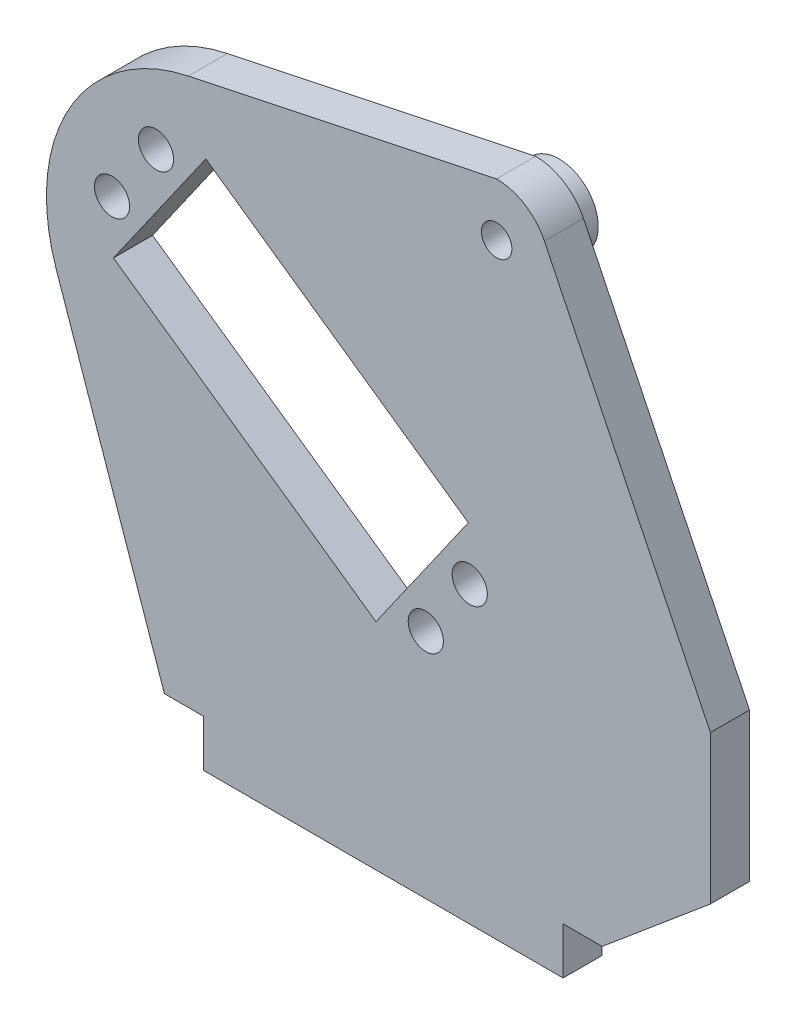
ISO-10303-21;
HEADER;
FILE_DESCRIPTION(('STEP AP214'),'2;1');
FILE_NAME('part.step','',(''),(''),'','','');
FILE_SCHEMA(('AUTOMOTIVE_DESIGN { 1 0 10303 214 1 1 1 1 }'));
ENDSEC;
DATA;
#1=APPLICATION_CONTEXT('core data for automotive mechanical design processes');
#2=APPLICATION_PROTOCOL_DEFINITION('international standard','automotive_design',2000,#1);
#3=PRODUCT_CONTEXT('',#1,'mechanical');
#4=PRODUCT('Part','Part','',(#3));
#5=PRODUCT_RELATED_PRODUCT_CATEGORY('part','',(#4));
#6=PRODUCT_DEFINITION_FORMATION('','',#4);
#7=PRODUCT_DEFINITION_CONTEXT('part definition',#1,'design');
#8=PRODUCT_DEFINITION('design','',#6,#7);
#9=PRODUCT_DEFINITION_SHAPE('','',#8);
#10=(LENGTH_UNIT() NAMED_UNIT(*) SI_UNIT(.MILLI.,.METRE.));
#11=(NAMED_UNIT(*) PLANE_ANGLE_UNIT() SI_UNIT($,.RADIAN.));
#12=(NAMED_UNIT(*) SI_UNIT($,.STERADIAN.) SOLID_ANGLE_UNIT());
#13=UNCERTAINTY_MEASURE_WITH_UNIT(LENGTH_MEASURE(1.E-05),#10,'distance_accuracy_value','');
#14=(GEOMETRIC_REPRESENTATION_CONTEXT(3) GLOBAL_UNCERTAINTY_ASSIGNED_CONTEXT((#13)) GLOBAL_UNIT_ASSIGNED_CONTEXT((#10,
#11,#12)) REPRESENTATION_CONTEXT('',''));
#15=CARTESIAN_POINT('',(0.,0.,0.));
#16=DIRECTION('',(0.,0.,1.));
#17=DIRECTION('',(1.,0.,0.));
#18=AXIS2_PLACEMENT_3D('',#15,#16,#17);
#19=CARTESIAN_POINT('',(-20.2199999704329,57.5799999999971,-5.));
#20=DIRECTION('',(0.,0.,1.));
#21=DIRECTION('',(1.,0.,0.));
#22=AXIS2_PLACEMENT_3D('',#19,#20,#21);
#23=PLANE('',#22);
#24=CARTESIAN_POINT('',(-20.2199999704329,57.5799999999971,-5.));
#25=DIRECTION('',(0.,0.,1.));
#26=DIRECTION('',(1.,0.,0.));
#27=AXIS2_PLACEMENT_3D('',#24,#25,#26);
#28=CIRCLE('',#27,22.8750000000009);
#29=CARTESIAN_POINT('',(-24.9455834674101,79.9615657542766,-5.));
#30=VERTEX_POINT('',#29);
#31=CARTESIAN_POINT('',(-41.8437615963378,50.1181933725053,-5.));
#32=VERTEX_POINT('',#31);
#33=EDGE_CURVE('E186',#30,#32,#28,.T.);
#34=ORIENTED_EDGE('',*,*,#33,.F.);
#35=DIRECTION('',(-0.978429104012181,-0.20658288511375,0.));
#36=VECTOR('',#35,1.);
#37=CARTESIAN_POINT('',(-24.9455834674101,79.9615657542766,-5.));
#38=LINE('',#37,#36);
#39=CARTESIAN_POINT('',(14.4999999833288,88.2899999768826,-5.));
#40=VERTEX_POINT('',#39);
#41=EDGE_CURVE('E220',#40,#30,#38,.T.);
#42=ORIENTED_EDGE('',*,*,#41,.F.);
#43=CARTESIAN_POINT('',(14.4999999833288,81.4999999892322,-5.));
#44=DIRECTION('',(0.,0.,1.));
#45=DIRECTION('',(1.,0.,0.));
#46=AXIS2_PLACEMENT_3D('',#43,#44,#45);
#47=CIRCLE('',#46,6.78999998765046);
#48=CARTESIAN_POINT('',(20.6106057278953,84.4605062410011,-5.));
#49=VERTEX_POINT('',#48);
#50=EDGE_CURVE('E217',#49,#40,#47,.T.);
#51=ORIENTED_EDGE('',*,*,#50,.F.);
#52=DIRECTION('',(-0.436009758049115,0.899941937508167,0.));
#53=VECTOR('',#52,1.);
#54=CARTESIAN_POINT('',(41.849999867857,40.6215297939108,-5.));
#55=LINE('',#54,#53);
#56=CARTESIAN_POINT('',(41.849999867857,40.6215297939108,-5.));
#57=VERTEX_POINT('',#56);
#58=EDGE_CURVE('E214',#57,#49,#55,.T.);
#59=ORIENTED_EDGE('',*,*,#58,.F.);
#60=DIRECTION('',(0.,1.,0.));
#61=VECTOR('',#60,1.);
#62=CARTESIAN_POINT('',(41.849999867857,21.6215298027008,-5.));
#63=LINE('',#62,#61);
#64=CARTESIAN_POINT('',(41.849999867857,21.6215298027008,-5.));
#65=VERTEX_POINT('',#64);
#66=EDGE_CURVE('E211',#65,#57,#63,.T.);
#67=ORIENTED_EDGE('',*,*,#66,.F.);
#68=DIRECTION('',(0.766044442804859,0.642787610060892,0.));
#69=VECTOR('',#68,1.);
#70=CARTESIAN_POINT('',(27.9999999773174,9.99999999120996,-5.));
#71=LINE('',#70,#69);
#72=CARTESIAN_POINT('',(27.9999999773174,9.99999999120996,-5.));
#73=VERTEX_POINT('',#72);
#74=EDGE_CURVE('E208',#73,#65,#71,.T.);
#75=ORIENTED_EDGE('',*,*,#74,.F.);
#76=DIRECTION('',(1.,0.,0.));
#77=VECTOR('',#76,1.);
#78=CARTESIAN_POINT('',(27.9999999773174,9.99999999120996,-5.));
#79=LINE('',#78,#77);
#80=CARTESIAN_POINT('',(22.9999999954636,9.99999999120996,-5.));
#81=VERTEX_POINT('',#80);
#82=EDGE_CURVE('E205',#81,#73,#79,.T.);
#83=ORIENTED_EDGE('',*,*,#82,.F.);
#84=DIRECTION('',(0.,1.,0.));
#85=VECTOR('',#84,1.);
#86=CARTESIAN_POINT('',(22.9999999954636,3.99999999120996,-5.));
#87=LINE('',#86,#85);
#88=CARTESIAN_POINT('',(22.9999999954636,3.99999999120996,-5.));
#89=VERTEX_POINT('',#88);
#90=EDGE_CURVE('E202',#89,#81,#87,.T.);
#91=ORIENTED_EDGE('',*,*,#90,.F.);
#92=DIRECTION('',(1.,0.,0.));
#93=VECTOR('',#92,1.);
#94=CARTESIAN_POINT('',(-22.9999999954636,3.99999999120996,-5.));
#95=LINE('',#94,#93);
#96=CARTESIAN_POINT('',(-22.9999999954636,3.99999999120996,-5.));
#97=VERTEX_POINT('',#96);
#98=EDGE_CURVE('E199',#97,#89,#95,.T.);
#99=ORIENTED_EDGE('',*,*,#98,.F.);
#100=DIRECTION('',(0.,-1.,0.));
#101=VECTOR('',#100,1.);
#102=CARTESIAN_POINT('',(-22.9999999954637,9.99999999120996,-5.));
#103=LINE('',#102,#101);
#104=CARTESIAN_POINT('',(-22.9999999954637,9.99999999120996,-5.));
#105=VERTEX_POINT('',#104);
#106=EDGE_CURVE('E196',#105,#97,#103,.T.);
#107=ORIENTED_EDGE('',*,*,#106,.F.);
#108=DIRECTION('',(1.,0.,0.));
#109=VECTOR('',#108,1.);
#110=CARTESIAN_POINT('',(-22.9999999954637,9.99999999120996,-5.));
#111=LINE('',#110,#109);
#112=CARTESIAN_POINT('',(-27.9999999773175,9.99999999120996,-5.));
#113=VERTEX_POINT('',#112);
#114=EDGE_CURVE('E193',#113,#105,#111,.T.);
#115=ORIENTED_EDGE('',*,*,#114,.F.);
#116=DIRECTION('',(0.32619919683023,-0.945301054684333,0.));
#117=VECTOR('',#116,1.);
#118=CARTESIAN_POINT('',(-27.9999999773175,9.99999999120996,-5.));
#119=LINE('',#118,#117);
#120=EDGE_CURVE('E189',#32,#113,#119,.T.);
#121=ORIENTED_EDGE('',*,*,#120,.F.);
#122=EDGE_LOOP('',(#34,#42,#51,#59,#67,#75,#83,#91,#99,#107,#115,#121));
#123=FACE_BOUND('',#122,.T.);
#124=DIRECTION('',(0.573576436351047,0.819152044288991,0.));
#125=VECTOR('',#124,1.);
#126=CARTESIAN_POINT('',(10.8767626858694,48.379790638379,-5.));
#127=LINE('',#126,#125);
#128=CARTESIAN_POINT('',(-0.938911902962183,31.5052585260258,-5.));
#129=VERTEX_POINT('',#128);
#130=CARTESIAN_POINT('',(10.8767626858694,48.379790638379,-5.));
#131=VERTEX_POINT('',#130);
#132=EDGE_CURVE('E154',#129,#131,#127,.T.);
#133=ORIENTED_EDGE('',*,*,#132,.T.);
#134=DIRECTION('',(-0.819152044288991,0.573576436351047,0.));
#135=VECTOR('',#134,1.);
#136=CARTESIAN_POINT('',(-22.7084711299793,71.8964245287719,-5.));
#137=LINE('',#136,#135);
#138=CARTESIAN_POINT('',(-22.7084711299793,71.8964245287719,-5.));
#139=VERTEX_POINT('',#138);
#140=EDGE_CURVE('E148',#131,#139,#137,.T.);
#141=ORIENTED_EDGE('',*,*,#140,.T.);
#142=DIRECTION('',(-0.573576436351047,-0.819152044288991,0.));
#143=VECTOR('',#142,1.);
#144=CARTESIAN_POINT('',(-22.7084711299793,71.8964245287719,-5.));
#145=LINE('',#144,#143);
#146=CARTESIAN_POINT('',(-34.5241457188108,55.0218924164187,-5.));
#147=VERTEX_POINT('',#146);
#148=EDGE_CURVE('E157',#139,#147,#145,.T.);
#149=ORIENTED_EDGE('',*,*,#148,.T.);
#150=DIRECTION('',(0.819152044288991,-0.573576436351047,0.));
#151=VECTOR('',#150,1.);
#152=CARTESIAN_POINT('',(-34.5241457188108,55.0218924164187,-5.));
#153=LINE('',#152,#151);
#154=EDGE_CURVE('E48',#147,#129,#153,.T.);
#155=ORIENTED_EDGE('',*,*,#154,.T.);
#156=EDGE_LOOP('',(#133,#141,#149,#155));
#157=FACE_BOUND('',#156,.T.);
#158=CARTESIAN_POINT('',(-29.0823920634309,69.7673092350156,-5.));
#159=DIRECTION('',(0.,0.,1.));
#160=DIRECTION('',(1.,0.,0.));
#161=AXIS2_PLACEMENT_3D('',#158,#159,#160);
#162=CIRCLE('',#161,2.25);
#163=CARTESIAN_POINT('',(-26.8323920634309,69.7673092350156,-5.));
#164=VERTEX_POINT('',#163);
#165=EDGE_CURVE('E176',#164,#164,#162,.T.);
#166=ORIENTED_EDGE('',*,*,#165,.T.);
#167=EDGE_LOOP('',(#166));
#168=FACE_BOUND('',#167,.T.);
#169=CARTESIAN_POINT('',(-34.7034411396711,61.7396192009835,-5.));
#170=DIRECTION('',(0.,0.,1.));
#171=DIRECTION('',(1.,0.,0.));
#172=AXIS2_PLACEMENT_3D('',#169,#170,#171);
#173=CIRCLE('',#172,2.25);
#174=CARTESIAN_POINT('',(-32.4534411396711,61.7396192009835,-5.));
#175=VERTEX_POINT('',#174);
#176=EDGE_CURVE('E397',#175,#175,#173,.T.);
#177=ORIENTED_EDGE('',*,*,#176,.T.);
#178=EDGE_LOOP('',(#177));
#179=FACE_BOUND('',#178,.T.);
#180=CARTESIAN_POINT('',(5.43500903048943,33.6343738197822,-5.));
#181=DIRECTION('',(0.,0.,1.));
#182=DIRECTION('',(-1.,0.,0.));
#183=AXIS2_PLACEMENT_3D('',#180,#181,#182);
#184=CIRCLE('',#183,2.25);
#185=CARTESIAN_POINT('',(3.18500903048943,33.6343738197822,-5.));
#186=VERTEX_POINT('',#185);
#187=EDGE_CURVE('E402',#186,#186,#184,.T.);
#188=ORIENTED_EDGE('',*,*,#187,.T.);
#189=EDGE_LOOP('',(#188));
#190=FACE_BOUND('',#189,.T.);
#191=CARTESIAN_POINT('',(11.0560581067297,41.6620638538143,-5.));
#192=DIRECTION('',(0.,0.,1.));
#193=DIRECTION('',(-1.,0.,0.));
#194=AXIS2_PLACEMENT_3D('',#191,#192,#193);
#195=CIRCLE('',#194,2.25);
#196=CARTESIAN_POINT('',(8.8060581067297,41.6620638538143,-5.));
#197=VERTEX_POINT('',#196);
#198=EDGE_CURVE('E406',#197,#197,#195,.T.);
#199=ORIENTED_EDGE('',*,*,#198,.T.);
#200=EDGE_LOOP('',(#199));
#201=FACE_BOUND('',#200,.T.);
#202=CARTESIAN_POINT('',(14.4999999833288,81.4999999892322,-5.));
#203=DIRECTION('',(0.,0.,1.));
#204=DIRECTION('',(1.,0.,0.));
#205=AXIS2_PLACEMENT_3D('',#202,#203,#204);
#206=CIRCLE('',#205,5.);
#207=CARTESIAN_POINT('',(19.4999999833288,81.4999999892322,-5.));
#208=VERTEX_POINT('',#207);
#209=EDGE_CURVE('E11',#208,#208,#206,.F.);
#210=ORIENTED_EDGE('',*,*,#209,.F.);
#211=EDGE_LOOP('',(#210));
#212=FACE_BOUND('',#211,.T.);
#213=ADVANCED_FACE('F33',(#123,#157,#168,#179,#190,#201,#212),#23,.F.);
#214=CARTESIAN_POINT('',(-20.2199999704329,57.5799999999971,-5.));
#215=DIRECTION('',(0.,0.,1.));
#216=DIRECTION('',(1.,0.,0.));
#217=AXIS2_PLACEMENT_3D('',#214,#215,#216);
#218=CYLINDRICAL_SURFACE('',#217,22.8750000000009);
#219=CARTESIAN_POINT('',(-20.2199999704329,57.5799999999971,0.));
#220=DIRECTION('',(0.,0.,1.));
#221=DIRECTION('',(1.,0.,0.));
#222=AXIS2_PLACEMENT_3D('',#219,#220,#221);
#223=CIRCLE('',#222,22.8750000000009);
#224=CARTESIAN_POINT('',(-24.9455834674101,79.9615657542766,0.));
#225=VERTEX_POINT('',#224);
#226=CARTESIAN_POINT('',(-41.8437615963378,50.1181933725053,0.));
#227=VERTEX_POINT('',#226);
#228=EDGE_CURVE('E182',#225,#227,#223,.T.);
#229=ORIENTED_EDGE('',*,*,#228,.F.);
#230=DIRECTION('',(0.,0.,1.));
#231=VECTOR('',#230,1.);
#232=CARTESIAN_POINT('',(-24.9455834674101,79.9615657542766,-5.));
#233=LINE('',#232,#231);
#234=EDGE_CURVE('E41',#30,#225,#233,.T.);
#235=ORIENTED_EDGE('',*,*,#234,.F.);
#236=ORIENTED_EDGE('',*,*,#33,.T.);
#237=DIRECTION('',(0.,0.,1.));
#238=VECTOR('',#237,1.);
#239=CARTESIAN_POINT('',(-41.8437615963378,50.1181933725053,-5.));
#240=LINE('',#239,#238);
#241=EDGE_CURVE('E223',#32,#227,#240,.T.);
#242=ORIENTED_EDGE('',*,*,#241,.T.);
#243=EDGE_LOOP('',(#229,#235,#236,#242));
#244=FACE_BOUND('',#243,.T.);
#245=ADVANCED_FACE('F35',(#244),#218,.T.);
#246=CARTESIAN_POINT('',(-24.9455834674101,79.9615657542766,-5.));
#247=DIRECTION('',(-0.20658288511375,0.978429104012181,0.));
#248=DIRECTION('',(-0.978429104012181,-0.20658288511375,0.));
#249=AXIS2_PLACEMENT_3D('',#246,#247,#248);
#250=PLANE('',#249);
#251=DIRECTION('',(-0.978429104012181,-0.20658288511375,0.));
#252=VECTOR('',#251,1.);
#253=CARTESIAN_POINT('',(-24.9455834674101,79.9615657542766,0.));
#254=LINE('',#253,#252);
#255=CARTESIAN_POINT('',(14.4999999833288,88.2899999768826,0.));
#256=VERTEX_POINT('',#255);
#257=EDGE_CURVE('E190',#256,#225,#254,.T.);
#258=ORIENTED_EDGE('',*,*,#257,.F.);
#259=DIRECTION('',(0.,0.,1.));
#260=VECTOR('',#259,1.);
#261=CARTESIAN_POINT('',(14.4999999833288,88.2899999768826,-5.));
#262=LINE('',#261,#260);
#263=EDGE_CURVE('E259',#40,#256,#262,.T.);
#264=ORIENTED_EDGE('',*,*,#263,.F.);
#265=ORIENTED_EDGE('',*,*,#41,.T.);
#266=ORIENTED_EDGE('',*,*,#234,.T.);
#267=EDGE_LOOP('',(#258,#264,#265,#266));
#268=FACE_BOUND('',#267,.T.);
#269=ADVANCED_FACE('F291',(#268),#250,.T.);
#270=CARTESIAN_POINT('',(14.4999999833288,81.4999999892322,-5.));
#271=DIRECTION('',(0.,0.,1.));
#272=DIRECTION('',(1.,0.,0.));
#273=AXIS2_PLACEMENT_3D('',#270,#271,#272);
#274=CYLINDRICAL_SURFACE('',#273,6.78999998765046);
#275=CARTESIAN_POINT('',(14.4999999833288,81.4999999892322,0.));
#276=DIRECTION('',(0.,0.,1.));
#277=DIRECTION('',(1.,0.,0.));
#278=AXIS2_PLACEMENT_3D('',#275,#276,#277);
#279=CIRCLE('',#278,6.78999998765046);
#280=CARTESIAN_POINT('',(20.6106057278953,84.4605062410011,0.));
#281=VERTEX_POINT('',#280);
#282=EDGE_CURVE('E253',#281,#256,#279,.T.);
#283=ORIENTED_EDGE('',*,*,#282,.F.);
#284=DIRECTION('',(0.,0.,1.));
#285=VECTOR('',#284,1.);
#286=CARTESIAN_POINT('',(20.6106057278953,84.4605062410011,-5.));
#287=LINE('',#286,#285);
#288=EDGE_CURVE('E261',#49,#281,#287,.T.);
#289=ORIENTED_EDGE('',*,*,#288,.F.);
#290=ORIENTED_EDGE('',*,*,#50,.T.);
#291=ORIENTED_EDGE('',*,*,#263,.T.);
#292=EDGE_LOOP('',(#283,#289,#290,#291));
#293=FACE_BOUND('',#292,.T.);
#294=ADVANCED_FACE('F327',(#293),#274,.T.);
#295=CARTESIAN_POINT('',(41.849999867857,40.6215297939108,-5.));
#296=DIRECTION('',(0.899941937508167,0.436009758049114,0.));
#297=DIRECTION('',(-0.436009758049114,0.899941937508167,0.));
#298=AXIS2_PLACEMENT_3D('',#295,#296,#297);
#299=PLANE('',#298);
#300=DIRECTION('',(-0.436009758049115,0.899941937508167,0.));
#301=VECTOR('',#300,1.);
#302=CARTESIAN_POINT('',(41.849999867857,40.6215297939108,0.));
#303=LINE('',#302,#301);
#304=CARTESIAN_POINT('',(41.849999867857,40.6215297939108,0.));
#305=VERTEX_POINT('',#304);
#306=EDGE_CURVE('E250',#305,#281,#303,.T.);
#307=ORIENTED_EDGE('',*,*,#306,.F.);
#308=DIRECTION('',(0.,0.,1.));
#309=VECTOR('',#308,1.);
#310=CARTESIAN_POINT('',(41.849999867857,40.6215297939108,-5.));
#311=LINE('',#310,#309);
#312=EDGE_CURVE('E263',#57,#305,#311,.T.);
#313=ORIENTED_EDGE('',*,*,#312,.F.);
#314=ORIENTED_EDGE('',*,*,#58,.T.);
#315=ORIENTED_EDGE('',*,*,#288,.T.);
#316=EDGE_LOOP('',(#307,#313,#314,#315));
#317=FACE_BOUND('',#316,.T.);
#318=ADVANCED_FACE('F324',(#317),#299,.T.);
#319=CARTESIAN_POINT('',(41.849999867857,21.6215298027008,-5.));
#320=DIRECTION('',(1.,0.,0.));
#321=DIRECTION('',(0.,0.,-1.));
#322=AXIS2_PLACEMENT_3D('',#319,#320,#321);
#323=PLANE('',#322);
#324=DIRECTION('',(0.,1.,0.));
#325=VECTOR('',#324,1.);
#326=CARTESIAN_POINT('',(41.849999867857,21.6215298027008,0.));
#327=LINE('',#326,#325);
#328=CARTESIAN_POINT('',(41.849999867857,21.6215298027008,0.));
#329=VERTEX_POINT('',#328);
#330=EDGE_CURVE('E247',#329,#305,#327,.T.);
#331=ORIENTED_EDGE('',*,*,#330,.F.);
#332=DIRECTION('',(0.,0.,1.));
#333=VECTOR('',#332,1.);
#334=CARTESIAN_POINT('',(41.849999867857,21.6215298027008,-5.));
#335=LINE('',#334,#333);
#336=EDGE_CURVE('E265',#65,#329,#335,.T.);
#337=ORIENTED_EDGE('',*,*,#336,.F.);
#338=ORIENTED_EDGE('',*,*,#66,.T.);
#339=ORIENTED_EDGE('',*,*,#312,.T.);
#340=EDGE_LOOP('',(#331,#337,#338,#339));
#341=FACE_BOUND('',#340,.T.);
#342=ADVANCED_FACE('F321',(#341),#323,.T.);
#343=CARTESIAN_POINT('',(27.9999999773174,9.99999999120996,-5.));
#344=DIRECTION('',(0.642787610060892,-0.766044442804859,0.));
#345=DIRECTION('',(0.766044442804859,0.642787610060892,0.));
#346=AXIS2_PLACEMENT_3D('',#343,#344,#345);
#347=PLANE('',#346);
#348=DIRECTION('',(0.766044442804859,0.642787610060892,0.));
#349=VECTOR('',#348,1.);
#350=CARTESIAN_POINT('',(27.9999999773174,9.99999999120996,0.));
#351=LINE('',#350,#349);
#352=CARTESIAN_POINT('',(27.9999999773174,9.99999999120996,0.));
#353=VERTEX_POINT('',#352);
#354=EDGE_CURVE('E244',#353,#329,#351,.T.);
#355=ORIENTED_EDGE('',*,*,#354,.F.);
#356=DIRECTION('',(0.,0.,1.));
#357=VECTOR('',#356,1.);
#358=CARTESIAN_POINT('',(27.9999999773174,9.99999999120996,-5.));
#359=LINE('',#358,#357);
#360=EDGE_CURVE('E267',#73,#353,#359,.T.);
#361=ORIENTED_EDGE('',*,*,#360,.F.);
#362=ORIENTED_EDGE('',*,*,#74,.T.);
#363=ORIENTED_EDGE('',*,*,#336,.T.);
#364=EDGE_LOOP('',(#355,#361,#362,#363));
#365=FACE_BOUND('',#364,.T.);
#366=ADVANCED_FACE('F317',(#365),#347,.T.);
#367=CARTESIAN_POINT('',(27.9999999773174,9.99999999120996,-5.));
#368=DIRECTION('',(0.,-1.,0.));
#369=DIRECTION('',(0.,0.,-1.));
#370=AXIS2_PLACEMENT_3D('',#367,#368,#369);
#371=PLANE('',#370);
#372=DIRECTION('',(1.,0.,0.));
#373=VECTOR('',#372,1.);
#374=CARTESIAN_POINT('',(27.9999999773174,9.99999999120996,0.));
#375=LINE('',#374,#373);
#376=CARTESIAN_POINT('',(22.9999999954636,9.99999999120996,0.));
#377=VERTEX_POINT('',#376);
#378=EDGE_CURVE('E241',#377,#353,#375,.T.);
#379=ORIENTED_EDGE('',*,*,#378,.F.);
#380=DIRECTION('',(0.,0.,1.));
#381=VECTOR('',#380,1.);
#382=CARTESIAN_POINT('',(22.9999999954636,9.99999999120996,-5.));
#383=LINE('',#382,#381);
#384=EDGE_CURVE('E269',#81,#377,#383,.T.);
#385=ORIENTED_EDGE('',*,*,#384,.F.);
#386=ORIENTED_EDGE('',*,*,#82,.T.);
#387=ORIENTED_EDGE('',*,*,#360,.T.);
#388=EDGE_LOOP('',(#379,#385,#386,#387));
#389=FACE_BOUND('',#388,.T.);
#390=ADVANCED_FACE('F313',(#389),#371,.T.);
#391=CARTESIAN_POINT('',(22.9999999954636,3.99999999120996,-5.));
#392=DIRECTION('',(1.,0.,0.));
#393=DIRECTION('',(0.,1.,0.));
#394=AXIS2_PLACEMENT_3D('',#391,#392,#393);
#395=PLANE('',#394);
#396=DIRECTION('',(0.,1.,0.));
#397=VECTOR('',#396,1.);
#398=CARTESIAN_POINT('',(22.9999999954636,3.99999999120996,0.));
#399=LINE('',#398,#397);
#400=CARTESIAN_POINT('',(22.9999999954636,3.99999999120996,0.));
#401=VERTEX_POINT('',#400);
#402=EDGE_CURVE('E238',#401,#377,#399,.T.);
#403=ORIENTED_EDGE('',*,*,#402,.F.);
#404=DIRECTION('',(0.,0.,1.));
#405=VECTOR('',#404,1.);
#406=CARTESIAN_POINT('',(22.9999999954636,3.99999999120996,-5.));
#407=LINE('',#406,#405);
#408=EDGE_CURVE('E271',#89,#401,#407,.T.);
#409=ORIENTED_EDGE('',*,*,#408,.F.);
#410=ORIENTED_EDGE('',*,*,#90,.T.);
#411=ORIENTED_EDGE('',*,*,#384,.T.);
#412=EDGE_LOOP('',(#403,#409,#410,#411));
#413=FACE_BOUND('',#412,.T.);
#414=ADVANCED_FACE('F309',(#413),#395,.T.);
#415=CARTESIAN_POINT('',(-22.9999999954636,3.99999999120996,-5.));
#416=DIRECTION('',(0.,-1.,0.));
#417=DIRECTION('',(0.,0.,-1.));
#418=AXIS2_PLACEMENT_3D('',#415,#416,#417);
#419=PLANE('',#418);
#420=DIRECTION('',(1.,0.,0.));
#421=VECTOR('',#420,1.);
#422=CARTESIAN_POINT('',(-22.9999999954636,3.99999999120996,0.));
#423=LINE('',#422,#421);
#424=CARTESIAN_POINT('',(-22.9999999954636,3.99999999120996,0.));
#425=VERTEX_POINT('',#424);
#426=EDGE_CURVE('E235',#425,#401,#423,.T.);
#427=ORIENTED_EDGE('',*,*,#426,.F.);
#428=DIRECTION('',(0.,0.,1.));
#429=VECTOR('',#428,1.);
#430=CARTESIAN_POINT('',(-22.9999999954636,3.99999999120996,-5.));
#431=LINE('',#430,#429);
#432=EDGE_CURVE('E273',#97,#425,#431,.T.);
#433=ORIENTED_EDGE('',*,*,#432,.F.);
#434=ORIENTED_EDGE('',*,*,#98,.T.);
#435=ORIENTED_EDGE('',*,*,#408,.T.);
#436=EDGE_LOOP('',(#427,#433,#434,#435));
#437=FACE_BOUND('',#436,.T.);
#438=ADVANCED_FACE('F305',(#437),#419,.T.);
#439=CARTESIAN_POINT('',(-22.9999999954637,9.99999999120996,-5.));
#440=DIRECTION('',(-1.,0.,0.));
#441=DIRECTION('',(0.,-1.,0.));
#442=AXIS2_PLACEMENT_3D('',#439,#440,#441);
#443=PLANE('',#442);
#444=DIRECTION('',(0.,-1.,0.));
#445=VECTOR('',#444,1.);
#446=CARTESIAN_POINT('',(-22.9999999954637,9.99999999120996,0.));
#447=LINE('',#446,#445);
#448=CARTESIAN_POINT('',(-22.9999999954637,9.99999999120996,0.));
#449=VERTEX_POINT('',#448);
#450=EDGE_CURVE('E232',#449,#425,#447,.T.);
#451=ORIENTED_EDGE('',*,*,#450,.F.);
#452=DIRECTION('',(0.,0.,1.));
#453=VECTOR('',#452,1.);
#454=CARTESIAN_POINT('',(-22.9999999954637,9.99999999120996,-5.));
#455=LINE('',#454,#453);
#456=EDGE_CURVE('E275',#105,#449,#455,.T.);
#457=ORIENTED_EDGE('',*,*,#456,.F.);
#458=ORIENTED_EDGE('',*,*,#106,.T.);
#459=ORIENTED_EDGE('',*,*,#432,.T.);
#460=EDGE_LOOP('',(#451,#457,#458,#459));
#461=FACE_BOUND('',#460,.T.);
#462=ADVANCED_FACE('F303',(#461),#443,.T.);
#463=CARTESIAN_POINT('',(-22.9999999954637,9.99999999120996,-5.));
#464=DIRECTION('',(0.,-1.,0.));
#465=DIRECTION('',(0.,0.,-1.));
#466=AXIS2_PLACEMENT_3D('',#463,#464,#465);
#467=PLANE('',#466);
#468=DIRECTION('',(1.,0.,0.));
#469=VECTOR('',#468,1.);
#470=CARTESIAN_POINT('',(-22.9999999954637,9.99999999120996,0.));
#471=LINE('',#470,#469);
#472=CARTESIAN_POINT('',(-27.9999999773175,9.99999999120996,0.));
#473=VERTEX_POINT('',#472);
#474=EDGE_CURVE('E229',#473,#449,#471,.T.);
#475=ORIENTED_EDGE('',*,*,#474,.F.);
#476=DIRECTION('',(0.,0.,1.));
#477=VECTOR('',#476,1.);
#478=CARTESIAN_POINT('',(-27.9999999773175,9.99999999120996,-5.));
#479=LINE('',#478,#477);
#480=EDGE_CURVE('E277',#113,#473,#479,.T.);
#481=ORIENTED_EDGE('',*,*,#480,.F.);
#482=ORIENTED_EDGE('',*,*,#114,.T.);
#483=ORIENTED_EDGE('',*,*,#456,.T.);
#484=EDGE_LOOP('',(#475,#481,#482,#483));
#485=FACE_BOUND('',#484,.T.);
#486=ADVANCED_FACE('F299',(#485),#467,.T.);
#487=CARTESIAN_POINT('',(-27.9999999773175,9.99999999120996,-5.));
#488=DIRECTION('',(-0.945301054684333,-0.32619919683023,0.));
#489=DIRECTION('',(0.32619919683023,-0.945301054684333,0.));
#490=AXIS2_PLACEMENT_3D('',#487,#488,#489);
#491=PLANE('',#490);
#492=DIRECTION('',(0.32619919683023,-0.945301054684333,0.));
#493=VECTOR('',#492,1.);
#494=CARTESIAN_POINT('',(-27.9999999773175,9.99999999120996,0.));
#495=LINE('',#494,#493);
#496=EDGE_CURVE('E226',#227,#473,#495,.T.);
#497=ORIENTED_EDGE('',*,*,#496,.F.);
#498=ORIENTED_EDGE('',*,*,#241,.F.);
#499=ORIENTED_EDGE('',*,*,#120,.T.);
#500=ORIENTED_EDGE('',*,*,#480,.T.);
#501=EDGE_LOOP('',(#497,#498,#499,#500));
#502=FACE_BOUND('',#501,.T.);
#503=ADVANCED_FACE('F284',(#502),#491,.T.);
#504=CARTESIAN_POINT('',(-20.2199999704329,57.5799999999971,0.));
#505=DIRECTION('',(0.,0.,1.));
#506=DIRECTION('',(1.,0.,0.));
#507=AXIS2_PLACEMENT_3D('',#504,#505,#506);
#508=PLANE('',#507);
#509=CARTESIAN_POINT('',(14.4999999833288,81.4999999892322,0.));
#510=DIRECTION('',(0.,0.,1.));
#511=DIRECTION('',(1.,0.,0.));
#512=AXIS2_PLACEMENT_3D('',#509,#510,#511);
#513=CIRCLE('',#512,1.94999999999999);
#514=CARTESIAN_POINT('',(16.4499999833288,81.4999999892322,0.));
#515=VERTEX_POINT('',#514);
#516=EDGE_CURVE('E354',#515,#515,#513,.T.);
#517=ORIENTED_EDGE('',*,*,#516,.F.);
#518=EDGE_LOOP('',(#517));
#519=FACE_BOUND('',#518,.T.);
#520=CARTESIAN_POINT('',(11.0560581067297,41.6620638538143,0.));
#521=DIRECTION('',(0.,0.,1.));
#522=DIRECTION('',(-1.,0.,0.));
#523=AXIS2_PLACEMENT_3D('',#520,#521,#522);
#524=CIRCLE('',#523,2.25);
#525=CARTESIAN_POINT('',(8.8060581067297,41.6620638538143,0.));
#526=VERTEX_POINT('',#525);
#527=EDGE_CURVE('E358',#526,#526,#524,.T.);
#528=ORIENTED_EDGE('',*,*,#527,.F.);
#529=EDGE_LOOP('',(#528));
#530=FACE_BOUND('',#529,.T.);
#531=CARTESIAN_POINT('',(5.43500903048943,33.6343738197822,0.));
#532=DIRECTION('',(0.,0.,1.));
#533=DIRECTION('',(-1.,0.,0.));
#534=AXIS2_PLACEMENT_3D('',#531,#532,#533);
#535=CIRCLE('',#534,2.25);
#536=CARTESIAN_POINT('',(3.18500903048943,33.6343738197822,0.));
#537=VERTEX_POINT('',#536);
#538=EDGE_CURVE('E362',#537,#537,#535,.T.);
#539=ORIENTED_EDGE('',*,*,#538,.F.);
#540=EDGE_LOOP('',(#539));
#541=FACE_BOUND('',#540,.T.);
#542=CARTESIAN_POINT('',(-34.7034411396711,61.7396192009835,0.));
#543=DIRECTION('',(0.,0.,1.));
#544=DIRECTION('',(1.,0.,0.));
#545=AXIS2_PLACEMENT_3D('',#542,#543,#544);
#546=CIRCLE('',#545,2.25);
#547=CARTESIAN_POINT('',(-32.4534411396711,61.7396192009835,0.));
#548=VERTEX_POINT('',#547);
#549=EDGE_CURVE('E366',#548,#548,#546,.T.);
#550=ORIENTED_EDGE('',*,*,#549,.F.);
#551=EDGE_LOOP('',(#550));
#552=FACE_BOUND('',#551,.T.);
#553=CARTESIAN_POINT('',(-29.0823920634309,69.7673092350156,0.));
#554=DIRECTION('',(0.,0.,1.));
#555=DIRECTION('',(1.,0.,0.));
#556=AXIS2_PLACEMENT_3D('',#553,#554,#555);
#557=CIRCLE('',#556,2.25);
#558=CARTESIAN_POINT('',(-26.8323920634309,69.7673092350156,0.));
#559=VERTEX_POINT('',#558);
#560=EDGE_CURVE('E169',#559,#559,#557,.T.);
#561=ORIENTED_EDGE('',*,*,#560,.F.);
#562=EDGE_LOOP('',(#561));
#563=FACE_BOUND('',#562,.T.);
#564=DIRECTION('',(-0.819152044288991,0.573576436351047,0.));
#565=VECTOR('',#564,1.);
#566=CARTESIAN_POINT('',(-22.7084711299793,71.8964245287719,0.));
#567=LINE('',#566,#565);
#568=CARTESIAN_POINT('',(10.8767626858694,48.379790638379,0.));
#569=VERTEX_POINT('',#568);
#570=CARTESIAN_POINT('',(-22.7084711299793,71.8964245287719,0.));
#571=VERTEX_POINT('',#570);
#572=EDGE_CURVE('E56',#569,#571,#567,.T.);
#573=ORIENTED_EDGE('',*,*,#572,.F.);
#574=DIRECTION('',(0.573576436351047,0.819152044288991,0.));
#575=VECTOR('',#574,1.);
#576=CARTESIAN_POINT('',(10.8767626858694,48.379790638379,0.));
#577=LINE('',#576,#575);
#578=CARTESIAN_POINT('',(-0.938911902962183,31.5052585260258,0.));
#579=VERTEX_POINT('',#578);
#580=EDGE_CURVE('E163',#579,#569,#577,.T.);
#581=ORIENTED_EDGE('',*,*,#580,.F.);
#582=DIRECTION('',(0.819152044288991,-0.573576436351047,0.));
#583=VECTOR('',#582,1.);
#584=CARTESIAN_POINT('',(-34.5241457188108,55.0218924164187,0.));
#585=LINE('',#584,#583);
#586=CARTESIAN_POINT('',(-34.5241457188108,55.0218924164187,0.));
#587=VERTEX_POINT('',#586);
#588=EDGE_CURVE('E166',#587,#579,#585,.T.);
#589=ORIENTED_EDGE('',*,*,#588,.F.);
#590=DIRECTION('',(-0.573576436351047,-0.819152044288991,0.));
#591=VECTOR('',#590,1.);
#592=CARTESIAN_POINT('',(-22.7084711299793,71.8964245287719,0.));
#593=LINE('',#592,#591);
#594=EDGE_CURVE('E175',#571,#587,#593,.T.);
#595=ORIENTED_EDGE('',*,*,#594,.F.);
#596=EDGE_LOOP('',(#573,#581,#589,#595));
#597=FACE_BOUND('',#596,.T.);
#598=ORIENTED_EDGE('',*,*,#228,.T.);
#599=ORIENTED_EDGE('',*,*,#496,.T.);
#600=ORIENTED_EDGE('',*,*,#474,.T.);
#601=ORIENTED_EDGE('',*,*,#450,.T.);
#602=ORIENTED_EDGE('',*,*,#426,.T.);
#603=ORIENTED_EDGE('',*,*,#402,.T.);
#604=ORIENTED_EDGE('',*,*,#378,.T.);
#605=ORIENTED_EDGE('',*,*,#354,.T.);
#606=ORIENTED_EDGE('',*,*,#330,.T.);
#607=ORIENTED_EDGE('',*,*,#306,.T.);
#608=ORIENTED_EDGE('',*,*,#282,.T.);
#609=ORIENTED_EDGE('',*,*,#257,.T.);
#610=EDGE_LOOP('',(#598,#599,#600,#601,#602,#603,#604,#605,#606,#607,#608,#609));
#611=FACE_BOUND('',#610,.T.);
#612=ADVANCED_FACE('F287',(#519,#530,#541,#552,#563,#597,#611),#508,.T.);
#613=CARTESIAN_POINT('',(-22.7084711299793,71.8964245287719,-5.));
#614=DIRECTION('',(0.573576436351047,0.819152044288991,0.));
#615=DIRECTION('',(-0.819152044288991,0.573576436351047,0.));
#616=AXIS2_PLACEMENT_3D('',#613,#614,#615);
#617=PLANE('',#616);
#618=ORIENTED_EDGE('',*,*,#572,.T.);
#619=DIRECTION('',(0.,0.,1.));
#620=VECTOR('',#619,1.);
#621=CARTESIAN_POINT('',(-22.7084711299793,71.8964245287719,-5.));
#622=LINE('',#621,#620);
#623=EDGE_CURVE('E144',#139,#571,#622,.T.);
#624=ORIENTED_EDGE('',*,*,#623,.F.);
#625=ORIENTED_EDGE('',*,*,#140,.F.);
#626=DIRECTION('',(0.,0.,1.));
#627=VECTOR('',#626,1.);
#628=CARTESIAN_POINT('',(10.8767626858694,48.379790638379,-5.));
#629=LINE('',#628,#627);
#630=EDGE_CURVE('E180',#131,#569,#629,.T.);
#631=ORIENTED_EDGE('',*,*,#630,.T.);
#632=EDGE_LOOP('',(#618,#624,#625,#631));
#633=FACE_BOUND('',#632,.T.);
#634=ADVANCED_FACE('F146',(#633),#617,.F.);
#635=CARTESIAN_POINT('',(10.8767626858694,48.379790638379,-5.));
#636=DIRECTION('',(0.819152044288991,-0.573576436351047,0.));
#637=DIRECTION('',(0.573576436351047,0.819152044288991,0.));
#638=AXIS2_PLACEMENT_3D('',#635,#636,#637);
#639=PLANE('',#638);
#640=ORIENTED_EDGE('',*,*,#580,.T.);
#641=ORIENTED_EDGE('',*,*,#630,.F.);
#642=ORIENTED_EDGE('',*,*,#132,.F.);
#643=DIRECTION('',(0.,0.,1.));
#644=VECTOR('',#643,1.);
#645=CARTESIAN_POINT('',(-0.938911902962183,31.5052585260258,-5.));
#646=LINE('',#645,#644);
#647=EDGE_CURVE('E183',#129,#579,#646,.T.);
#648=ORIENTED_EDGE('',*,*,#647,.T.);
#649=EDGE_LOOP('',(#640,#641,#642,#648));
#650=FACE_BOUND('',#649,.T.);
#651=ADVANCED_FACE('F350',(#650),#639,.F.);
#652=CARTESIAN_POINT('',(-34.5241457188108,55.0218924164187,-5.));
#653=DIRECTION('',(-0.573576436351047,-0.819152044288991,0.));
#654=DIRECTION('',(0.819152044288991,-0.573576436351047,0.));
#655=AXIS2_PLACEMENT_3D('',#652,#653,#654);
#656=PLANE('',#655);
#657=ORIENTED_EDGE('',*,*,#588,.T.);
#658=ORIENTED_EDGE('',*,*,#647,.F.);
#659=ORIENTED_EDGE('',*,*,#154,.F.);
#660=DIRECTION('',(0.,0.,1.));
#661=VECTOR('',#660,1.);
#662=CARTESIAN_POINT('',(-34.5241457188108,55.0218924164187,-5.));
#663=LINE('',#662,#661);
#664=EDGE_CURVE('E153',#147,#587,#663,.T.);
#665=ORIENTED_EDGE('',*,*,#664,.T.);
#666=EDGE_LOOP('',(#657,#658,#659,#665));
#667=FACE_BOUND('',#666,.T.);
#668=ADVANCED_FACE('F372',(#667),#656,.F.);
#669=CARTESIAN_POINT('',(-22.7084711299793,71.8964245287719,-5.));
#670=DIRECTION('',(-0.819152044288991,0.573576436351047,0.));
#671=DIRECTION('',(-0.573576436351047,-0.819152044288991,0.));
#672=AXIS2_PLACEMENT_3D('',#669,#670,#671);
#673=PLANE('',#672);
#674=ORIENTED_EDGE('',*,*,#594,.T.);
#675=ORIENTED_EDGE('',*,*,#664,.F.);
#676=ORIENTED_EDGE('',*,*,#148,.F.);
#677=ORIENTED_EDGE('',*,*,#623,.T.);
#678=EDGE_LOOP('',(#674,#675,#676,#677));
#679=FACE_BOUND('',#678,.T.);
#680=ADVANCED_FACE('F158',(#679),#673,.F.);
#681=CARTESIAN_POINT('',(-29.0823920634309,69.7673092350156,-5.));
#682=DIRECTION('',(0.,0.,1.));
#683=DIRECTION('',(1.,0.,0.));
#684=AXIS2_PLACEMENT_3D('',#681,#682,#683);
#685=CYLINDRICAL_SURFACE('',#684,2.25);
#686=ORIENTED_EDGE('',*,*,#165,.F.);
#687=EDGE_LOOP('',(#686));
#688=FACE_BOUND('',#687,.T.);
#689=ORIENTED_EDGE('',*,*,#560,.T.);
#690=EDGE_LOOP('',(#689));
#691=FACE_BOUND('',#690,.T.);
#692=ADVANCED_FACE('F381',(#688,#691),#685,.F.);
#693=CARTESIAN_POINT('',(-34.7034411396711,61.7396192009835,-5.));
#694=DIRECTION('',(0.,0.,1.));
#695=DIRECTION('',(1.,0.,0.));
#696=AXIS2_PLACEMENT_3D('',#693,#694,#695);
#697=CYLINDRICAL_SURFACE('',#696,2.25);
#698=ORIENTED_EDGE('',*,*,#176,.F.);
#699=EDGE_LOOP('',(#698));
#700=FACE_BOUND('',#699,.T.);
#701=ORIENTED_EDGE('',*,*,#549,.T.);
#702=EDGE_LOOP('',(#701));
#703=FACE_BOUND('',#702,.T.);
#704=ADVANCED_FACE('F387',(#700,#703),#697,.F.);
#705=CARTESIAN_POINT('',(5.43500903048943,33.6343738197822,-5.));
#706=DIRECTION('',(0.,0.,1.));
#707=DIRECTION('',(1.,0.,0.));
#708=AXIS2_PLACEMENT_3D('',#705,#706,#707);
#709=CYLINDRICAL_SURFACE('',#708,2.25);
#710=ORIENTED_EDGE('',*,*,#187,.F.);
#711=EDGE_LOOP('',(#710));
#712=FACE_BOUND('',#711,.T.);
#713=ORIENTED_EDGE('',*,*,#538,.T.);
#714=EDGE_LOOP('',(#713));
#715=FACE_BOUND('',#714,.T.);
#716=ADVANCED_FACE('F392',(#712,#715),#709,.F.);
#717=CARTESIAN_POINT('',(11.0560581067297,41.6620638538143,-5.));
#718=DIRECTION('',(0.,0.,1.));
#719=DIRECTION('',(1.,0.,0.));
#720=AXIS2_PLACEMENT_3D('',#717,#718,#719);
#721=CYLINDRICAL_SURFACE('',#720,2.25);
#722=ORIENTED_EDGE('',*,*,#198,.F.);
#723=EDGE_LOOP('',(#722));
#724=FACE_BOUND('',#723,.T.);
#725=ORIENTED_EDGE('',*,*,#527,.T.);
#726=EDGE_LOOP('',(#725));
#727=FACE_BOUND('',#726,.T.);
#728=ADVANCED_FACE('F433',(#724,#727),#721,.F.);
#729=CARTESIAN_POINT('',(14.4999999833288,81.4999999892322,0.));
#730=DIRECTION('',(0.,0.,1.));
#731=DIRECTION('',(1.,0.,0.));
#732=AXIS2_PLACEMENT_3D('',#729,#730,#731);
#733=CYLINDRICAL_SURFACE('',#732,1.95);
#734=ORIENTED_EDGE('',*,*,#516,.T.);
#735=EDGE_LOOP('',(#734));
#736=FACE_BOUND('',#735,.T.);
#737=CARTESIAN_POINT('',(14.4999999833288,81.4999999892322,-8.));
#738=DIRECTION('',(0.,0.,-1.));
#739=DIRECTION('',(-1.,0.,0.));
#740=AXIS2_PLACEMENT_3D('',#737,#738,#739);
#741=CIRCLE('',#740,1.95);
#742=CARTESIAN_POINT('',(12.5499999833288,81.4999999892322,-8.));
#743=VERTEX_POINT('',#742);
#744=EDGE_CURVE('E416',#743,#743,#741,.T.);
#745=ORIENTED_EDGE('',*,*,#744,.T.);
#746=EDGE_LOOP('',(#745));
#747=FACE_BOUND('',#746,.T.);
#748=ADVANCED_FACE('F420',(#736,#747),#733,.F.);
#749=CARTESIAN_POINT('',(14.4999999833288,81.4999999892322,-8.));
#750=DIRECTION('',(0.,0.,-1.));
#751=DIRECTION('',(-1.,0.,0.));
#752=AXIS2_PLACEMENT_3D('',#749,#750,#751);
#753=PLANE('',#752);
#754=CARTESIAN_POINT('',(14.4999999833288,81.4999999892322,-8.));
#755=DIRECTION('',(0.,0.,-1.));
#756=DIRECTION('',(-1.,0.,0.));
#757=AXIS2_PLACEMENT_3D('',#754,#755,#756);
#758=CIRCLE('',#757,5.);
#759=CARTESIAN_POINT('',(9.49999998332877,81.4999999892322,-8.));
#760=VERTEX_POINT('',#759);
#761=EDGE_CURVE('E413',#760,#760,#758,.T.);
#762=ORIENTED_EDGE('',*,*,#761,.T.);
#763=EDGE_LOOP('',(#762));
#764=FACE_BOUND('',#763,.T.);
#765=ORIENTED_EDGE('',*,*,#744,.F.);
#766=EDGE_LOOP('',(#765));
#767=FACE_BOUND('',#766,.T.);
#768=ADVANCED_FACE('F422',(#764,#767),#753,.T.);
#769=CARTESIAN_POINT('',(14.4999999833288,81.4999999892322,-8.));
#770=DIRECTION('',(0.,0.,1.));
#771=DIRECTION('',(1.,0.,0.));
#772=AXIS2_PLACEMENT_3D('',#769,#770,#771);
#773=CYLINDRICAL_SURFACE('',#772,5.);
#774=ORIENTED_EDGE('',*,*,#761,.F.);
#775=EDGE_LOOP('',(#774));
#776=FACE_BOUND('',#775,.T.);
#777=ORIENTED_EDGE('',*,*,#209,.T.);
#778=EDGE_LOOP('',(#777));
#779=FACE_BOUND('',#778,.T.);
#780=ADVANCED_FACE('F424',(#776,#779),#773,.T.);
#781=CLOSED_SHELL('',(#213,#245,#269,#294,#318,#342,#366,#390,#414,#438,#462,#486,#503,#612,
#634,#651,#668,#680,#692,#704,#716,#728,#748,#768,#780));
#782=MANIFOLD_SOLID_BREP('B2',#781);
#783=ADVANCED_BREP_SHAPE_REPRESENTATION('',(#18,#782),#14);
#784=SHAPE_DEFINITION_REPRESENTATION(#9,#783);
ENDSEC;
END-ISO-10303-21;
